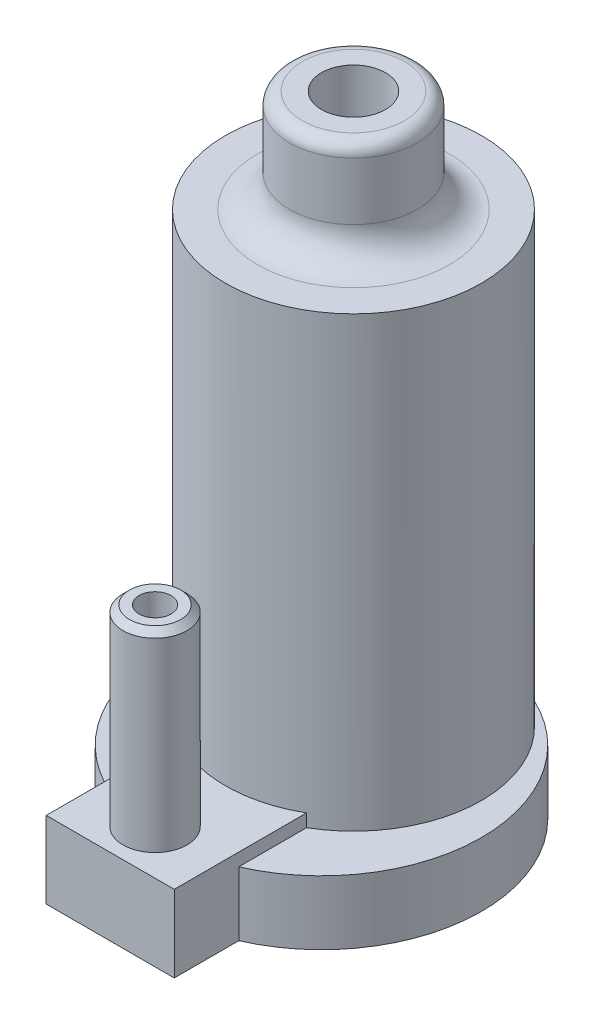
ISO-10303-21;
HEADER;
FILE_DESCRIPTION(('STEP AP214'),'2;1');
FILE_NAME('part.step','',(''),(''),'','','');
FILE_SCHEMA(('AUTOMOTIVE_DESIGN { 1 0 10303 214 1 1 1 1 }'));
ENDSEC;
DATA;
#1=APPLICATION_CONTEXT('core data for automotive mechanical design processes');
#2=APPLICATION_PROTOCOL_DEFINITION('international standard','automotive_design',2000,#1);
#3=PRODUCT_CONTEXT('',#1,'mechanical');
#4=PRODUCT('Part','Part','',(#3));
#5=PRODUCT_RELATED_PRODUCT_CATEGORY('part','',(#4));
#6=PRODUCT_DEFINITION_FORMATION('','',#4);
#7=PRODUCT_DEFINITION_CONTEXT('part definition',#1,'design');
#8=PRODUCT_DEFINITION('design','',#6,#7);
#9=PRODUCT_DEFINITION_SHAPE('','',#8);
#10=(LENGTH_UNIT() NAMED_UNIT(*) SI_UNIT(.MILLI.,.METRE.));
#11=(NAMED_UNIT(*) PLANE_ANGLE_UNIT() SI_UNIT($,.RADIAN.));
#12=(NAMED_UNIT(*) SI_UNIT($,.STERADIAN.) SOLID_ANGLE_UNIT());
#13=UNCERTAINTY_MEASURE_WITH_UNIT(LENGTH_MEASURE(1.E-05),#10,'distance_accuracy_value','');
#14=(GEOMETRIC_REPRESENTATION_CONTEXT(3) GLOBAL_UNCERTAINTY_ASSIGNED_CONTEXT((#13)) GLOBAL_UNIT_ASSIGNED_CONTEXT((#10,
#11,#12)) REPRESENTATION_CONTEXT('',''));
#15=CARTESIAN_POINT('',(0.,0.,0.));
#16=DIRECTION('',(0.,0.,1.));
#17=DIRECTION('',(1.,0.,0.));
#18=AXIS2_PLACEMENT_3D('',#15,#16,#17);
#19=CARTESIAN_POINT('',(0.,10.,5.));
#20=DIRECTION('',(0.,-1.,0.));
#21=DIRECTION('',(0.,0.,-1.));
#22=AXIS2_PLACEMENT_3D('',#19,#20,#21);
#23=PLANE('',#22);
#24=CARTESIAN_POINT('',(0.,10.,5.));
#25=DIRECTION('',(0.,-1.,0.));
#26=DIRECTION('',(0.,0.,-1.));
#27=AXIS2_PLACEMENT_3D('',#24,#25,#26);
#28=CIRCLE('',#27,25.);
#29=CARTESIAN_POINT('',(-10.,10.,27.9128784747792));
#30=VERTEX_POINT('',#29);
#31=CARTESIAN_POINT('',(0.,9.99999999999997,-20.));
#32=VERTEX_POINT('',#31);
#33=EDGE_CURVE('E166',#30,#32,#28,.T.);
#34=ORIENTED_EDGE('',*,*,#33,.F.);
#35=DIRECTION('',(0.,0.,-1.));
#36=VECTOR('',#35,1.);
#37=CARTESIAN_POINT('',(-10.,10.,5.00000000000001));
#38=LINE('',#37,#36);
#39=CARTESIAN_POINT('',(-10.,9.99999999999999,17.3205080756888));
#40=VERTEX_POINT('',#39);
#41=EDGE_CURVE('E150',#30,#40,#38,.T.);
#42=ORIENTED_EDGE('',*,*,#41,.T.);
#43=CARTESIAN_POINT('',(0.,9.99999999999999,0.));
#44=DIRECTION('',(0.,-1.,0.));
#45=DIRECTION('',(0.,0.,-1.));
#46=AXIS2_PLACEMENT_3D('',#43,#44,#45);
#47=CIRCLE('',#46,20.);
#48=EDGE_CURVE('E68',#40,#32,#47,.T.);
#49=ORIENTED_EDGE('',*,*,#48,.T.);
#50=EDGE_LOOP('',(#34,#42,#49));
#51=FACE_BOUND('',#50,.T.);
#52=ADVANCED_FACE('F43',(#51),#23,.F.);
#53=CARTESIAN_POINT('',(0.,80.,0.));
#54=DIRECTION('',(0.,-1.,0.));
#55=DIRECTION('',(0.,0.,-1.));
#56=AXIS2_PLACEMENT_3D('',#53,#54,#55);
#57=CYLINDRICAL_SURFACE('',#56,20.);
#58=ORIENTED_EDGE('',*,*,#48,.F.);
#59=DIRECTION('',(0.,-1.,0.));
#60=VECTOR('',#59,1.);
#61=CARTESIAN_POINT('',(-10.,80.,17.3205080756888));
#62=LINE('',#61,#60);
#63=CARTESIAN_POINT('',(-10.,12.,17.3205080756888));
#64=VERTEX_POINT('',#63);
#65=EDGE_CURVE('E156',#40,#64,#62,.F.);
#66=ORIENTED_EDGE('',*,*,#65,.T.);
#67=CARTESIAN_POINT('',(0.,12.,0.));
#68=DIRECTION('',(0.,-1.,0.));
#69=DIRECTION('',(0.,0.,-1.));
#70=AXIS2_PLACEMENT_3D('',#67,#68,#69);
#71=CIRCLE('',#70,20.);
#72=CARTESIAN_POINT('',(10.,12.,17.3205080756888));
#73=VERTEX_POINT('',#72);
#74=EDGE_CURVE('E177',#73,#64,#71,.T.);
#75=ORIENTED_EDGE('',*,*,#74,.F.);
#76=DIRECTION('',(0.,-1.,0.));
#77=VECTOR('',#76,1.);
#78=CARTESIAN_POINT('',(10.,80.,17.3205080756888));
#79=LINE('',#78,#77);
#80=CARTESIAN_POINT('',(10.,9.99999999999999,17.3205080756888));
#81=VERTEX_POINT('',#80);
#82=EDGE_CURVE('E108',#73,#81,#79,.T.);
#83=ORIENTED_EDGE('',*,*,#82,.T.);
#84=EDGE_CURVE('E173',#32,#81,#47,.T.);
#85=ORIENTED_EDGE('',*,*,#84,.F.);
#86=EDGE_LOOP('',(#58,#66,#75,#83,#85));
#87=FACE_BOUND('',#86,.T.);
#88=CARTESIAN_POINT('',(0.,80.,0.));
#89=DIRECTION('',(0.,1.,0.));
#90=DIRECTION('',(0.,0.,1.));
#91=AXIS2_PLACEMENT_3D('',#88,#89,#90);
#92=CIRCLE('',#91,20.);
#93=CARTESIAN_POINT('',(0.,80.,20.));
#94=VERTEX_POINT('',#93);
#95=EDGE_CURVE('E165',#94,#94,#92,.T.);
#96=ORIENTED_EDGE('',*,*,#95,.F.);
#97=EDGE_LOOP('',(#96));
#98=FACE_BOUND('',#97,.T.);
#99=ADVANCED_FACE('F217',(#87,#98),#57,.T.);
#100=CARTESIAN_POINT('',(0.,80.,0.));
#101=DIRECTION('',(0.,1.,0.));
#102=DIRECTION('',(0.,0.,1.));
#103=AXIS2_PLACEMENT_3D('',#100,#101,#102);
#104=PLANE('',#103);
#105=CARTESIAN_POINT('',(0.,80.,0.));
#106=DIRECTION('',(0.,1.,0.));
#107=DIRECTION('',(0.,0.,1.));
#108=AXIS2_PLACEMENT_3D('',#105,#106,#107);
#109=CIRCLE('',#108,15.);
#110=CARTESIAN_POINT('',(0.,80.,15.));
#111=VERTEX_POINT('',#110);
#112=EDGE_CURVE('E188',#111,#111,#109,.F.);
#113=ORIENTED_EDGE('',*,*,#112,.T.);
#114=EDGE_LOOP('',(#113));
#115=FACE_BOUND('',#114,.T.);
#116=ORIENTED_EDGE('',*,*,#95,.T.);
#117=EDGE_LOOP('',(#116));
#118=FACE_BOUND('',#117,.T.);
#119=ADVANCED_FACE('F223',(#115,#118),#104,.T.);
#120=CARTESIAN_POINT('',(0.,96.,0.));
#121=DIRECTION('',(0.,-1.,0.));
#122=DIRECTION('',(0.,0.,-1.));
#123=AXIS2_PLACEMENT_3D('',#120,#121,#122);
#124=CYLINDRICAL_SURFACE('',#123,10.);
#125=CARTESIAN_POINT('',(0.,94.,0.));
#126=DIRECTION('',(0.,1.,0.));
#127=DIRECTION('',(0.,0.,1.));
#128=AXIS2_PLACEMENT_3D('',#125,#126,#127);
#129=CIRCLE('',#128,10.);
#130=CARTESIAN_POINT('',(0.,94.,10.));
#131=VERTEX_POINT('',#130);
#132=EDGE_CURVE('E196',#131,#131,#129,.F.);
#133=ORIENTED_EDGE('',*,*,#132,.T.);
#134=EDGE_LOOP('',(#133));
#135=FACE_BOUND('',#134,.T.);
#136=CARTESIAN_POINT('',(0.,85.,0.));
#137=DIRECTION('',(0.,1.,0.));
#138=DIRECTION('',(0.,0.,1.));
#139=AXIS2_PLACEMENT_3D('',#136,#137,#138);
#140=CIRCLE('',#139,10.);
#141=CARTESIAN_POINT('',(0.,85.,10.));
#142=VERTEX_POINT('',#141);
#143=EDGE_CURVE('E184',#142,#142,#140,.T.);
#144=ORIENTED_EDGE('',*,*,#143,.T.);
#145=EDGE_LOOP('',(#144));
#146=FACE_BOUND('',#145,.T.);
#147=ADVANCED_FACE('F368',(#135,#146),#124,.T.);
#148=CARTESIAN_POINT('',(0.,96.,0.));
#149=DIRECTION('',(0.,1.,0.));
#150=DIRECTION('',(0.,0.,1.));
#151=AXIS2_PLACEMENT_3D('',#148,#149,#150);
#152=PLANE('',#151);
#153=CARTESIAN_POINT('',(0.,96.,0.));
#154=DIRECTION('',(0.,1.,0.));
#155=DIRECTION('',(0.,0.,1.));
#156=AXIS2_PLACEMENT_3D('',#153,#154,#155);
#157=CIRCLE('',#156,5.);
#158=CARTESIAN_POINT('',(0.,96.,5.));
#159=VERTEX_POINT('',#158);
#160=EDGE_CURVE('E248',#159,#159,#157,.T.);
#161=ORIENTED_EDGE('',*,*,#160,.F.);
#162=EDGE_LOOP('',(#161));
#163=FACE_BOUND('',#162,.T.);
#164=CARTESIAN_POINT('',(0.,96.,0.));
#165=DIRECTION('',(0.,1.,0.));
#166=DIRECTION('',(0.,0.,1.));
#167=AXIS2_PLACEMENT_3D('',#164,#165,#166);
#168=CIRCLE('',#167,8.);
#169=CARTESIAN_POINT('',(0.,96.,8.));
#170=VERTEX_POINT('',#169);
#171=EDGE_CURVE('E192',#170,#170,#168,.T.);
#172=ORIENTED_EDGE('',*,*,#171,.T.);
#173=EDGE_LOOP('',(#172));
#174=FACE_BOUND('',#173,.T.);
#175=ADVANCED_FACE('F239',(#163,#174),#152,.T.);
#176=CARTESIAN_POINT('',(0.,10.,5.));
#177=DIRECTION('',(0.,-1.,0.));
#178=DIRECTION('',(0.,0.,-1.));
#179=AXIS2_PLACEMENT_3D('',#176,#177,#178);
#180=CYLINDRICAL_SURFACE('',#179,25.);
#181=DIRECTION('',(0.,-1.,0.));
#182=VECTOR('',#181,1.);
#183=CARTESIAN_POINT('',(-10.,10.,27.9128784747792));
#184=LINE('',#183,#182);
#185=CARTESIAN_POINT('',(-10.,0.,27.9128784747792));
#186=VERTEX_POINT('',#185);
#187=EDGE_CURVE('E153',#30,#186,#184,.T.);
#188=ORIENTED_EDGE('',*,*,#187,.F.);
#189=ORIENTED_EDGE('',*,*,#33,.T.);
#190=CARTESIAN_POINT('',(10.,10.,27.9128784747792));
#191=VERTEX_POINT('',#190);
#192=EDGE_CURVE('E161',#32,#191,#28,.T.);
#193=ORIENTED_EDGE('',*,*,#192,.T.);
#194=DIRECTION('',(0.,-1.,0.));
#195=VECTOR('',#194,1.);
#196=CARTESIAN_POINT('',(10.,10.,27.9128784747792));
#197=LINE('',#196,#195);
#198=CARTESIAN_POINT('',(10.,0.,27.9128784747792));
#199=VERTEX_POINT('',#198);
#200=EDGE_CURVE('E60',#199,#191,#197,.F.);
#201=ORIENTED_EDGE('',*,*,#200,.F.);
#202=CARTESIAN_POINT('',(0.,0.,5.));
#203=DIRECTION('',(0.,-1.,0.));
#204=DIRECTION('',(0.,0.,-1.));
#205=AXIS2_PLACEMENT_3D('',#202,#203,#204);
#206=CIRCLE('',#205,25.);
#207=EDGE_CURVE('E160',#186,#199,#206,.T.);
#208=ORIENTED_EDGE('',*,*,#207,.F.);
#209=EDGE_LOOP('',(#188,#189,#193,#201,#208));
#210=FACE_BOUND('',#209,.T.);
#211=ADVANCED_FACE('F230',(#210),#180,.T.);
#212=ORIENTED_EDGE('',*,*,#84,.T.);
#213=DIRECTION('',(0.,0.,1.));
#214=VECTOR('',#213,1.);
#215=CARTESIAN_POINT('',(10.,10.,5.00000000000001));
#216=LINE('',#215,#214);
#217=EDGE_CURVE('E142',#81,#191,#216,.T.);
#218=ORIENTED_EDGE('',*,*,#217,.T.);
#219=ORIENTED_EDGE('',*,*,#192,.F.);
#220=EDGE_LOOP('',(#212,#218,#219));
#221=FACE_BOUND('',#220,.T.);
#222=ADVANCED_FACE('F219',(#221),#23,.F.);
#223=CARTESIAN_POINT('',(0.,0.,0.));
#224=DIRECTION('',(0.,1.,0.));
#225=DIRECTION('',(0.,0.,1.));
#226=AXIS2_PLACEMENT_3D('',#223,#224,#225);
#227=PLANE('',#226);
#228=ORIENTED_EDGE('',*,*,#207,.T.);
#229=DIRECTION('',(0.,0.,1.));
#230=VECTOR('',#229,1.);
#231=CARTESIAN_POINT('',(10.,0.,38.));
#232=LINE('',#231,#230);
#233=CARTESIAN_POINT('',(10.,0.,38.));
#234=VERTEX_POINT('',#233);
#235=EDGE_CURVE('E135',#199,#234,#232,.T.);
#236=ORIENTED_EDGE('',*,*,#235,.T.);
#237=DIRECTION('',(-1.,0.,0.));
#238=VECTOR('',#237,1.);
#239=CARTESIAN_POINT('',(-10.,0.,38.));
#240=LINE('',#239,#238);
#241=CARTESIAN_POINT('',(-10.,0.,38.));
#242=VERTEX_POINT('',#241);
#243=EDGE_CURVE('E120',#234,#242,#240,.T.);
#244=ORIENTED_EDGE('',*,*,#243,.T.);
#245=DIRECTION('',(0.,0.,-1.));
#246=VECTOR('',#245,1.);
#247=CARTESIAN_POINT('',(-10.,0.,38.));
#248=LINE('',#247,#246);
#249=EDGE_CURVE('E131',#242,#186,#248,.T.);
#250=ORIENTED_EDGE('',*,*,#249,.T.);
#251=EDGE_LOOP('',(#228,#236,#244,#250));
#252=FACE_BOUND('',#251,.T.);
#253=ADVANCED_FACE('F229',(#252),#227,.F.);
#254=CARTESIAN_POINT('',(-10.,12.,38.));
#255=DIRECTION('',(-1.,0.,0.));
#256=DIRECTION('',(0.,0.,1.));
#257=AXIS2_PLACEMENT_3D('',#254,#255,#256);
#258=PLANE('',#257);
#259=ORIENTED_EDGE('',*,*,#65,.F.);
#260=ORIENTED_EDGE('',*,*,#41,.F.);
#261=ORIENTED_EDGE('',*,*,#187,.T.);
#262=ORIENTED_EDGE('',*,*,#249,.F.);
#263=DIRECTION('',(0.,-1.,0.));
#264=VECTOR('',#263,1.);
#265=CARTESIAN_POINT('',(-10.,12.,38.));
#266=LINE('',#265,#264);
#267=CARTESIAN_POINT('',(-10.,12.,38.));
#268=VERTEX_POINT('',#267);
#269=EDGE_CURVE('E122',#268,#242,#266,.T.);
#270=ORIENTED_EDGE('',*,*,#269,.F.);
#271=DIRECTION('',(0.,0.,-1.));
#272=VECTOR('',#271,1.);
#273=CARTESIAN_POINT('',(-10.,12.,38.));
#274=LINE('',#273,#272);
#275=EDGE_CURVE('E114',#268,#64,#274,.T.);
#276=ORIENTED_EDGE('',*,*,#275,.T.);
#277=EDGE_LOOP('',(#259,#260,#261,#262,#270,#276));
#278=FACE_BOUND('',#277,.T.);
#279=ADVANCED_FACE('F236',(#278),#258,.T.);
#280=CARTESIAN_POINT('',(10.,12.,38.));
#281=DIRECTION('',(1.,0.,0.));
#282=DIRECTION('',(0.,0.,-1.));
#283=AXIS2_PLACEMENT_3D('',#280,#281,#282);
#284=PLANE('',#283);
#285=ORIENTED_EDGE('',*,*,#82,.F.);
#286=DIRECTION('',(0.,0.,1.));
#287=VECTOR('',#286,1.);
#288=CARTESIAN_POINT('',(10.,12.,38.));
#289=LINE('',#288,#287);
#290=CARTESIAN_POINT('',(10.,12.,38.));
#291=VERTEX_POINT('',#290);
#292=EDGE_CURVE('E102',#73,#291,#289,.T.);
#293=ORIENTED_EDGE('',*,*,#292,.T.);
#294=DIRECTION('',(0.,-1.,0.));
#295=VECTOR('',#294,1.);
#296=CARTESIAN_POINT('',(10.,12.,38.));
#297=LINE('',#296,#295);
#298=EDGE_CURVE('E105',#291,#234,#297,.T.);
#299=ORIENTED_EDGE('',*,*,#298,.T.);
#300=ORIENTED_EDGE('',*,*,#235,.F.);
#301=ORIENTED_EDGE('',*,*,#200,.T.);
#302=ORIENTED_EDGE('',*,*,#217,.F.);
#303=EDGE_LOOP('',(#285,#293,#299,#300,#301,#302));
#304=FACE_BOUND('',#303,.T.);
#305=ADVANCED_FACE('F104',(#304),#284,.T.);
#306=CARTESIAN_POINT('',(-10.,12.,38.));
#307=DIRECTION('',(0.,0.,1.));
#308=DIRECTION('',(1.,0.,0.));
#309=AXIS2_PLACEMENT_3D('',#306,#307,#308);
#310=PLANE('',#309);
#311=ORIENTED_EDGE('',*,*,#243,.F.);
#312=ORIENTED_EDGE('',*,*,#298,.F.);
#313=DIRECTION('',(-1.,0.,0.));
#314=VECTOR('',#313,1.);
#315=CARTESIAN_POINT('',(-10.,12.,38.));
#316=LINE('',#315,#314);
#317=EDGE_CURVE('E113',#291,#268,#316,.T.);
#318=ORIENTED_EDGE('',*,*,#317,.T.);
#319=ORIENTED_EDGE('',*,*,#269,.T.);
#320=EDGE_LOOP('',(#311,#312,#318,#319));
#321=FACE_BOUND('',#320,.T.);
#322=ADVANCED_FACE('F118',(#321),#310,.T.);
#323=CARTESIAN_POINT('',(0.,12.,0.));
#324=DIRECTION('',(0.,-1.,0.));
#325=DIRECTION('',(0.,0.,-1.));
#326=AXIS2_PLACEMENT_3D('',#323,#324,#325);
#327=PLANE('',#326);
#328=CARTESIAN_POINT('',(0.,12.,31.));
#329=DIRECTION('',(0.,-1.,0.));
#330=DIRECTION('',(0.,0.,-1.));
#331=AXIS2_PLACEMENT_3D('',#328,#329,#330);
#332=CIRCLE('',#331,5.);
#333=CARTESIAN_POINT('',(0.,12.,26.));
#334=VERTEX_POINT('',#333);
#335=EDGE_CURVE('E180',#334,#334,#332,.F.);
#336=ORIENTED_EDGE('',*,*,#335,.F.);
#337=EDGE_LOOP('',(#336));
#338=FACE_BOUND('',#337,.T.);
#339=ORIENTED_EDGE('',*,*,#292,.F.);
#340=ORIENTED_EDGE('',*,*,#74,.T.);
#341=ORIENTED_EDGE('',*,*,#275,.F.);
#342=ORIENTED_EDGE('',*,*,#317,.F.);
#343=EDGE_LOOP('',(#339,#340,#341,#342));
#344=FACE_BOUND('',#343,.T.);
#345=ADVANCED_FACE('F125',(#338,#344),#327,.F.);
#346=CARTESIAN_POINT('',(0.,42.,31.));
#347=DIRECTION('',(0.,-1.,0.));
#348=DIRECTION('',(0.,0.,-1.));
#349=AXIS2_PLACEMENT_3D('',#346,#347,#348);
#350=CYLINDRICAL_SURFACE('',#349,5.);
#351=CARTESIAN_POINT('',(0.,41.,31.));
#352=DIRECTION('',(0.,1.,0.));
#353=DIRECTION('',(0.,0.,1.));
#354=AXIS2_PLACEMENT_3D('',#351,#352,#353);
#355=CIRCLE('',#354,5.);
#356=CARTESIAN_POINT('',(0.,41.,36.));
#357=VERTEX_POINT('',#356);
#358=EDGE_CURVE('E11',#357,#357,#355,.F.);
#359=ORIENTED_EDGE('',*,*,#358,.T.);
#360=EDGE_LOOP('',(#359));
#361=FACE_BOUND('',#360,.T.);
#362=ORIENTED_EDGE('',*,*,#335,.T.);
#363=EDGE_LOOP('',(#362));
#364=FACE_BOUND('',#363,.T.);
#365=ADVANCED_FACE('F271',(#361,#364),#350,.T.);
#366=CARTESIAN_POINT('',(0.,42.,31.));
#367=DIRECTION('',(0.,1.,0.));
#368=DIRECTION('',(0.,0.,1.));
#369=AXIS2_PLACEMENT_3D('',#366,#367,#368);
#370=PLANE('',#369);
#371=CARTESIAN_POINT('',(0.,42.,31.));
#372=DIRECTION('',(0.,1.,0.));
#373=DIRECTION('',(0.,0.,1.));
#374=AXIS2_PLACEMENT_3D('',#371,#372,#373);
#375=CIRCLE('',#374,4.);
#376=CARTESIAN_POINT('',(0.,42.,35.));
#377=VERTEX_POINT('',#376);
#378=EDGE_CURVE('E53',#377,#377,#375,.T.);
#379=ORIENTED_EDGE('',*,*,#378,.T.);
#380=EDGE_LOOP('',(#379));
#381=FACE_BOUND('',#380,.T.);
#382=CARTESIAN_POINT('',(0.,42.,31.));
#383=DIRECTION('',(0.,1.,0.));
#384=DIRECTION('',(0.,0.,1.));
#385=AXIS2_PLACEMENT_3D('',#382,#383,#384);
#386=CIRCLE('',#385,2.5);
#387=CARTESIAN_POINT('',(0.,42.,33.5));
#388=VERTEX_POINT('',#387);
#389=EDGE_CURVE('E256',#388,#388,#386,.T.);
#390=ORIENTED_EDGE('',*,*,#389,.F.);
#391=EDGE_LOOP('',(#390));
#392=FACE_BOUND('',#391,.T.);
#393=ADVANCED_FACE('F203',(#381,#392),#370,.T.);
#394=CARTESIAN_POINT('',(0.,85.,0.));
#395=DIRECTION('',(0.,1.,0.));
#396=DIRECTION('',(0.,0.,1.));
#397=AXIS2_PLACEMENT_3D('',#394,#395,#396);
#398=TOROIDAL_SURFACE('',#397,15.,5.);
#399=ORIENTED_EDGE('',*,*,#112,.F.);
#400=EDGE_LOOP('',(#399));
#401=FACE_BOUND('',#400,.T.);
#402=ORIENTED_EDGE('',*,*,#143,.F.);
#403=EDGE_LOOP('',(#402));
#404=FACE_BOUND('',#403,.T.);
#405=ADVANCED_FACE('F270',(#401,#404),#398,.F.);
#406=CARTESIAN_POINT('',(0.,94.,0.));
#407=DIRECTION('',(0.,1.,0.));
#408=DIRECTION('',(0.,0.,1.));
#409=AXIS2_PLACEMENT_3D('',#406,#407,#408);
#410=TOROIDAL_SURFACE('',#409,8.,2.);
#411=ORIENTED_EDGE('',*,*,#132,.F.);
#412=EDGE_LOOP('',(#411));
#413=FACE_BOUND('',#412,.T.);
#414=ORIENTED_EDGE('',*,*,#171,.F.);
#415=EDGE_LOOP('',(#414));
#416=FACE_BOUND('',#415,.T.);
#417=ADVANCED_FACE('F277',(#413,#416),#410,.T.);
#418=CARTESIAN_POINT('',(0.,66.,0.));
#419=DIRECTION('',(0.,1.,0.));
#420=DIRECTION('',(0.,0.,1.));
#421=AXIS2_PLACEMENT_3D('',#418,#419,#420);
#422=CYLINDRICAL_SURFACE('',#421,5.);
#423=CARTESIAN_POINT('',(0.,66.,0.));
#424=DIRECTION('',(0.,1.,0.));
#425=DIRECTION('',(0.,0.,1.));
#426=AXIS2_PLACEMENT_3D('',#423,#424,#425);
#427=CIRCLE('',#426,5.);
#428=CARTESIAN_POINT('',(0.,66.,5.));
#429=VERTEX_POINT('',#428);
#430=EDGE_CURVE('E136',#429,#429,#427,.T.);
#431=ORIENTED_EDGE('',*,*,#430,.F.);
#432=EDGE_LOOP('',(#431));
#433=FACE_BOUND('',#432,.T.);
#434=ORIENTED_EDGE('',*,*,#160,.T.);
#435=EDGE_LOOP('',(#434));
#436=FACE_BOUND('',#435,.T.);
#437=ADVANCED_FACE('F283',(#433,#436),#422,.F.);
#438=CARTESIAN_POINT('',(0.,66.,0.));
#439=DIRECTION('',(0.,1.,0.));
#440=DIRECTION('',(0.,0.,1.));
#441=AXIS2_PLACEMENT_3D('',#438,#439,#440);
#442=PLANE('',#441);
#443=ORIENTED_EDGE('',*,*,#430,.T.);
#444=EDGE_LOOP('',(#443));
#445=FACE_BOUND('',#444,.T.);
#446=ADVANCED_FACE('F266',(#445),#442,.T.);
#447=CARTESIAN_POINT('',(0.,12.,31.));
#448=DIRECTION('',(0.,1.,0.));
#449=DIRECTION('',(0.,0.,1.));
#450=AXIS2_PLACEMENT_3D('',#447,#448,#449);
#451=CYLINDRICAL_SURFACE('',#450,2.5);
#452=CARTESIAN_POINT('',(0.,12.,31.));
#453=DIRECTION('',(0.,1.,0.));
#454=DIRECTION('',(0.,0.,1.));
#455=AXIS2_PLACEMENT_3D('',#452,#453,#454);
#456=CIRCLE('',#455,2.5);
#457=CARTESIAN_POINT('',(0.,12.,33.5));
#458=VERTEX_POINT('',#457);
#459=EDGE_CURVE('E252',#458,#458,#456,.T.);
#460=ORIENTED_EDGE('',*,*,#459,.F.);
#461=EDGE_LOOP('',(#460));
#462=FACE_BOUND('',#461,.T.);
#463=ORIENTED_EDGE('',*,*,#389,.T.);
#464=EDGE_LOOP('',(#463));
#465=FACE_BOUND('',#464,.T.);
#466=ADVANCED_FACE('F212',(#462,#465),#451,.F.);
#467=CARTESIAN_POINT('',(0.,12.,31.));
#468=DIRECTION('',(0.,1.,0.));
#469=DIRECTION('',(0.,0.,1.));
#470=AXIS2_PLACEMENT_3D('',#467,#468,#469);
#471=PLANE('',#470);
#472=ORIENTED_EDGE('',*,*,#459,.T.);
#473=EDGE_LOOP('',(#472));
#474=FACE_BOUND('',#473,.T.);
#475=ADVANCED_FACE('F207',(#474),#471,.T.);
#476=CARTESIAN_POINT('',(0.,42.,31.));
#477=DIRECTION('',(0.,-1.,0.));
#478=DIRECTION('',(0.,0.,-1.));
#479=AXIS2_PLACEMENT_3D('',#476,#477,#478);
#480=CONICAL_SURFACE('',#479,4.,0.78539816339744);
#481=ORIENTED_EDGE('',*,*,#358,.F.);
#482=EDGE_LOOP('',(#481));
#483=FACE_BOUND('',#482,.T.);
#484=ORIENTED_EDGE('',*,*,#378,.F.);
#485=EDGE_LOOP('',(#484));
#486=FACE_BOUND('',#485,.T.);
#487=ADVANCED_FACE('F46',(#483,#486),#480,.T.);
#488=CLOSED_SHELL('',(#52,#99,#119,#147,#175,#211,#222,#253,#279,#305,#322,#345,#365,#393,#405,
#417,#437,#446,#466,#475,#487));
#489=MANIFOLD_SOLID_BREP('B2',#488);
#490=ADVANCED_BREP_SHAPE_REPRESENTATION('',(#18,#489),#14);
#491=SHAPE_DEFINITION_REPRESENTATION(#9,#490);
ENDSEC;
END-ISO-10303-21;
